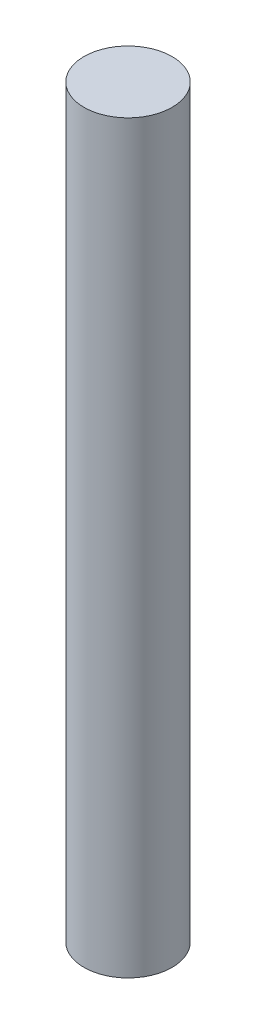
ISO-10303-21;
HEADER;
FILE_DESCRIPTION(('STEP AP214'),'2;1');
FILE_NAME('part.step','',(''),(''),'','','');
FILE_SCHEMA(('AUTOMOTIVE_DESIGN { 1 0 10303 214 1 1 1 1 }'));
ENDSEC;
DATA;
#1=APPLICATION_CONTEXT('core data for automotive mechanical design processes');
#2=APPLICATION_PROTOCOL_DEFINITION('international standard','automotive_design',2000,#1);
#3=PRODUCT_CONTEXT('',#1,'mechanical');
#4=PRODUCT('Part','Part','',(#3));
#5=PRODUCT_RELATED_PRODUCT_CATEGORY('part','',(#4));
#6=PRODUCT_DEFINITION_FORMATION('','',#4);
#7=PRODUCT_DEFINITION_CONTEXT('part definition',#1,'design');
#8=PRODUCT_DEFINITION('design','',#6,#7);
#9=PRODUCT_DEFINITION_SHAPE('','',#8);
#10=(LENGTH_UNIT() NAMED_UNIT(*) SI_UNIT(.MILLI.,.METRE.));
#11=(NAMED_UNIT(*) PLANE_ANGLE_UNIT() SI_UNIT($,.RADIAN.));
#12=(NAMED_UNIT(*) SI_UNIT($,.STERADIAN.) SOLID_ANGLE_UNIT());
#13=UNCERTAINTY_MEASURE_WITH_UNIT(LENGTH_MEASURE(1.E-05),#10,'distance_accuracy_value','');
#14=(GEOMETRIC_REPRESENTATION_CONTEXT(3) GLOBAL_UNCERTAINTY_ASSIGNED_CONTEXT((#13)) GLOBAL_UNIT_ASSIGNED_CONTEXT((#10,
#11,#12)) REPRESENTATION_CONTEXT('',''));
#15=CARTESIAN_POINT('',(0.,0.,0.));
#16=DIRECTION('',(0.,0.,1.));
#17=DIRECTION('',(1.,0.,0.));
#18=AXIS2_PLACEMENT_3D('',#15,#16,#17);
#19=CARTESIAN_POINT('',(0.,53.7,0.));
#20=DIRECTION('',(0.,-1.,0.));
#21=DIRECTION('',(0.,0.,-1.));
#22=AXIS2_PLACEMENT_3D('',#19,#20,#21);
#23=CYLINDRICAL_SURFACE('',#22,3.175);
#24=CARTESIAN_POINT('',(0.,53.7,0.));
#25=DIRECTION('',(0.,1.,0.));
#26=DIRECTION('',(0.,0.,1.));
#27=AXIS2_PLACEMENT_3D('',#24,#25,#26);
#28=CIRCLE('',#27,3.175);
#29=CARTESIAN_POINT('',(0.,53.7,-3.175));
#30=VERTEX_POINT('',#29);
#31=EDGE_CURVE('E10',#30,#30,#28,.T.);
#32=CARTESIAN_POINT('',(0.,0.,0.));
#33=DIRECTION('',(0.,1.,0.));
#34=DIRECTION('',(0.,0.,1.));
#35=AXIS2_PLACEMENT_3D('',#32,#33,#34);
#36=CIRCLE('',#35,3.175);
#37=CARTESIAN_POINT('',(0.,0.,-3.175));
#38=VERTEX_POINT('',#37);
#39=EDGE_CURVE('E36',#38,#38,#36,.T.);
#40=CARTESIAN_POINT('',(0.,53.7,-3.175));
#41=CARTESIAN_POINT('',(0.,53.140625,-3.175));
#42=CARTESIAN_POINT('',(0.,52.58125,-3.175));
#43=CARTESIAN_POINT('',(0.,51.4625,-3.175));
#44=CARTESIAN_POINT('',(0.,50.903125,-3.175));
#45=CARTESIAN_POINT('',(0.,49.784375,-3.175));
#46=CARTESIAN_POINT('',(0.,49.225,-3.175));
#47=CARTESIAN_POINT('',(0.,48.10625,-3.175));
#48=CARTESIAN_POINT('',(0.,47.546875,-3.175));
#49=CARTESIAN_POINT('',(0.,46.428125,-3.175));
#50=CARTESIAN_POINT('',(0.,45.86875,-3.175));
#51=CARTESIAN_POINT('',(0.,44.75,-3.175));
#52=CARTESIAN_POINT('',(0.,44.190625,-3.175));
#53=CARTESIAN_POINT('',(0.,43.071875,-3.175));
#54=CARTESIAN_POINT('',(0.,42.5125,-3.175));
#55=CARTESIAN_POINT('',(0.,41.39375,-3.175));
#56=CARTESIAN_POINT('',(0.,40.834375,-3.175));
#57=CARTESIAN_POINT('',(0.,39.715625,-3.175));
#58=CARTESIAN_POINT('',(0.,39.15625,-3.175));
#59=CARTESIAN_POINT('',(0.,38.0375,-3.175));
#60=CARTESIAN_POINT('',(0.,37.478125,-3.175));
#61=CARTESIAN_POINT('',(0.,36.359375,-3.175));
#62=CARTESIAN_POINT('',(0.,35.8,-3.175));
#63=CARTESIAN_POINT('',(0.,34.68125,-3.175));
#64=CARTESIAN_POINT('',(0.,34.121875,-3.175));
#65=CARTESIAN_POINT('',(0.,33.003125,-3.175));
#66=CARTESIAN_POINT('',(0.,32.44375,-3.175));
#67=CARTESIAN_POINT('',(0.,31.325,-3.175));
#68=CARTESIAN_POINT('',(0.,30.765625,-3.175));
#69=CARTESIAN_POINT('',(0.,29.646875,-3.175));
#70=CARTESIAN_POINT('',(0.,29.0875,-3.175));
#71=CARTESIAN_POINT('',(0.,27.96875,-3.175));
#72=CARTESIAN_POINT('',(0.,27.409375,-3.175));
#73=CARTESIAN_POINT('',(0.,26.290625,-3.175));
#74=CARTESIAN_POINT('',(0.,25.73125,-3.175));
#75=CARTESIAN_POINT('',(0.,24.6125,-3.175));
#76=CARTESIAN_POINT('',(0.,24.053125,-3.175));
#77=CARTESIAN_POINT('',(0.,22.934375,-3.175));
#78=CARTESIAN_POINT('',(0.,22.375,-3.175));
#79=CARTESIAN_POINT('',(0.,21.25625,-3.175));
#80=CARTESIAN_POINT('',(0.,20.696875,-3.175));
#81=CARTESIAN_POINT('',(0.,19.578125,-3.175));
#82=CARTESIAN_POINT('',(0.,19.01875,-3.175));
#83=CARTESIAN_POINT('',(0.,17.9,-3.175));
#84=CARTESIAN_POINT('',(0.,17.340625,-3.175));
#85=CARTESIAN_POINT('',(0.,16.221875,-3.175));
#86=CARTESIAN_POINT('',(0.,15.6625,-3.175));
#87=CARTESIAN_POINT('',(0.,14.54375,-3.175));
#88=CARTESIAN_POINT('',(0.,13.984375,-3.175));
#89=CARTESIAN_POINT('',(0.,12.865625,-3.175));
#90=CARTESIAN_POINT('',(0.,12.30625,-3.175));
#91=CARTESIAN_POINT('',(0.,11.1875,-3.175));
#92=CARTESIAN_POINT('',(0.,10.628125,-3.175));
#93=CARTESIAN_POINT('',(0.,9.509375,-3.175));
#94=CARTESIAN_POINT('',(0.,8.95,-3.175));
#95=CARTESIAN_POINT('',(0.,7.83125,-3.175));
#96=CARTESIAN_POINT('',(0.,7.271875,-3.175));
#97=CARTESIAN_POINT('',(0.,6.153125,-3.175));
#98=CARTESIAN_POINT('',(0.,5.59375,-3.175));
#99=CARTESIAN_POINT('',(0.,4.475,-3.175));
#100=CARTESIAN_POINT('',(0.,3.915625,-3.175));
#101=CARTESIAN_POINT('',(0.,2.796875,-3.175));
#102=CARTESIAN_POINT('',(0.,2.2375,-3.175));
#103=CARTESIAN_POINT('',(0.,1.11875,-3.175));
#104=CARTESIAN_POINT('',(0.,0.559375000000002,-3.175));
#105=CARTESIAN_POINT('',(0.,0.,-3.175));
#106=B_SPLINE_CURVE_WITH_KNOTS('',3,(#40,#41,#42,#43,#44,#45,#46,#47,#48,#49,#50,#51,#52,#53,
#54,#55,#56,#57,#58,#59,#60,#61,#62,#63,#64,#65,#66,#67,#68,#69,#70,#71,#72,#73,#74,#75,#76,#77,
#78,#79,#80,#81,#82,#83,#84,#85,#86,#87,#88,#89,#90,#91,#92,#93,#94,#95,#96,#97,#98,#99,#100,
#101,#102,#103,#104,#105),.UNSPECIFIED.,.F.,.F.,(4,2,2,2,2,2,2,2,2,2,2,2,2,2,2,2,2,2,2,2,2,2,2,
2,2,2,2,2,2,2,2,2,4),(0.,1.678125,3.35625,5.03437499999999,6.7125,8.390625,10.06875,11.746875,
13.425,15.103125,16.78125,18.459375,20.1375,21.815625,23.49375,25.171875,26.85,28.528125,
30.20625,31.884375,33.5625,35.240625,36.91875,38.596875,40.275,41.953125,43.63125,45.309375,
46.9875,48.665625,50.34375,52.021875,53.7),.UNSPECIFIED.);
#107=EDGE_CURVE('BSEAM33',#30,#38,#106,.T.);
#108=ORIENTED_EDGE('',*,*,#31,.F.);
#109=ORIENTED_EDGE('',*,*,#39,.T.);
#110=ORIENTED_EDGE('',*,*,#107,.T.);
#111=ORIENTED_EDGE('',*,*,#107,.F.);
#112=EDGE_LOOP('',(#108,#110,#109,#111));
#113=FACE_BOUND('',#112,.T.);
#114=ADVANCED_FACE('F33',(#113),#23,.T.);
#115=CARTESIAN_POINT('',(0.,53.7,0.));
#116=DIRECTION('',(0.,1.,0.));
#117=DIRECTION('',(0.,0.,1.));
#118=AXIS2_PLACEMENT_3D('',#115,#116,#117);
#119=PLANE('',#118);
#120=ORIENTED_EDGE('',*,*,#31,.T.);
#121=EDGE_LOOP('',(#120));
#122=FACE_BOUND('',#121,.T.);
#123=ADVANCED_FACE('F48',(#122),#119,.T.);
#124=CARTESIAN_POINT('',(0.,0.,0.));
#125=DIRECTION('',(0.,1.,0.));
#126=DIRECTION('',(0.,0.,1.));
#127=AXIS2_PLACEMENT_3D('',#124,#125,#126);
#128=PLANE('',#127);
#129=ORIENTED_EDGE('',*,*,#39,.F.);
#130=EDGE_LOOP('',(#129));
#131=FACE_BOUND('',#130,.T.);
#132=ADVANCED_FACE('F46',(#131),#128,.F.);
#133=CLOSED_SHELL('',(#114,#123,#132));
#134=MANIFOLD_SOLID_BREP('B2',#133);
#135=ADVANCED_BREP_SHAPE_REPRESENTATION('',(#18,#134),#14);
#136=SHAPE_DEFINITION_REPRESENTATION(#9,#135);
ENDSEC;
END-ISO-10303-21;
